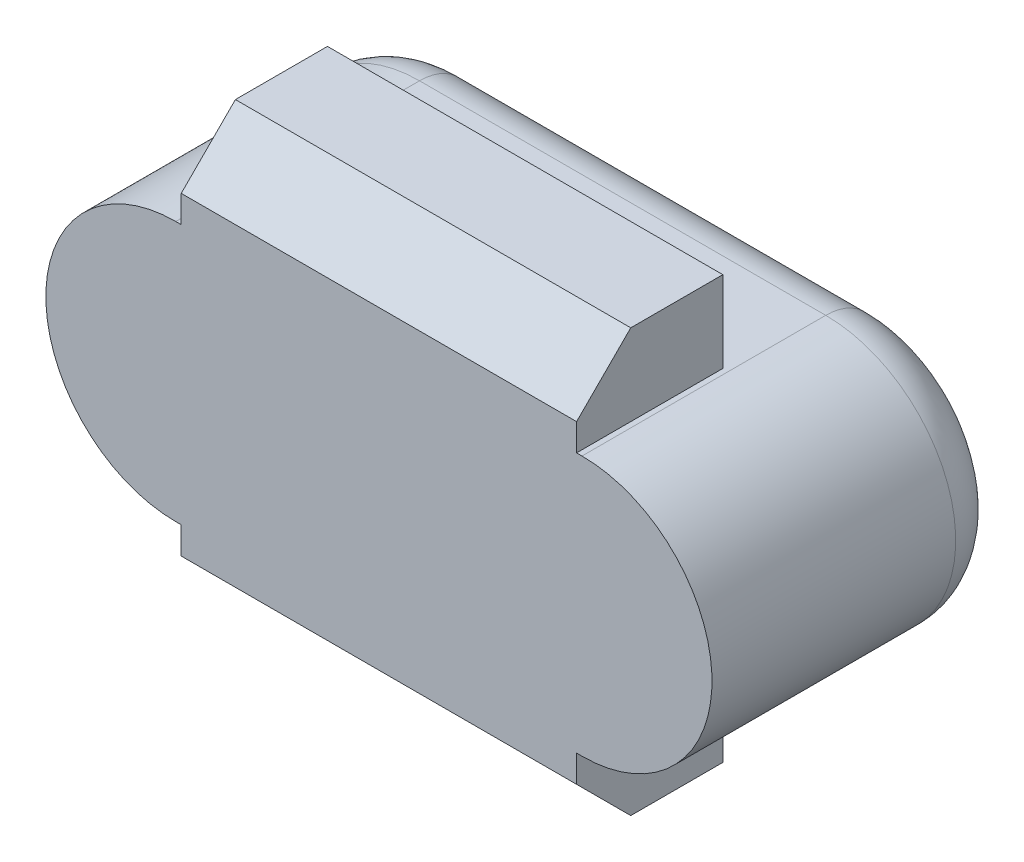
ISO-10303-21;
HEADER;
FILE_DESCRIPTION(('STEP AP214'),'2;1');
FILE_NAME('part.step','',(''),(''),'','','');
FILE_SCHEMA(('AUTOMOTIVE_DESIGN { 1 0 10303 214 1 1 1 1 }'));
ENDSEC;
DATA;
#1=APPLICATION_CONTEXT('core data for automotive mechanical design processes');
#2=APPLICATION_PROTOCOL_DEFINITION('international standard','automotive_design',2000,#1);
#3=PRODUCT_CONTEXT('',#1,'mechanical');
#4=PRODUCT('Part','Part','',(#3));
#5=PRODUCT_RELATED_PRODUCT_CATEGORY('part','',(#4));
#6=PRODUCT_DEFINITION_FORMATION('','',#4);
#7=PRODUCT_DEFINITION_CONTEXT('part definition',#1,'design');
#8=PRODUCT_DEFINITION('design','',#6,#7);
#9=PRODUCT_DEFINITION_SHAPE('','',#8);
#10=(LENGTH_UNIT() NAMED_UNIT(*) SI_UNIT(.MILLI.,.METRE.));
#11=(NAMED_UNIT(*) PLANE_ANGLE_UNIT() SI_UNIT($,.RADIAN.));
#12=(NAMED_UNIT(*) SI_UNIT($,.STERADIAN.) SOLID_ANGLE_UNIT());
#13=UNCERTAINTY_MEASURE_WITH_UNIT(LENGTH_MEASURE(1.E-05),#10,'distance_accuracy_value','');
#14=(GEOMETRIC_REPRESENTATION_CONTEXT(3) GLOBAL_UNCERTAINTY_ASSIGNED_CONTEXT((#13)) GLOBAL_UNIT_ASSIGNED_CONTEXT((#10,
#11,#12)) REPRESENTATION_CONTEXT('',''));
#15=CARTESIAN_POINT('',(0.,0.,0.));
#16=DIRECTION('',(0.,0.,1.));
#17=DIRECTION('',(1.,0.,0.));
#18=AXIS2_PLACEMENT_3D('',#15,#16,#17);
#19=CARTESIAN_POINT('',(0.,0.,5.5));
#20=DIRECTION('',(0.,0.,-1.));
#21=DIRECTION('',(-1.,0.,0.));
#22=AXIS2_PLACEMENT_3D('',#19,#20,#21);
#23=CYLINDRICAL_SURFACE('',#22,2.4);
#24=DIRECTION('',(0.,0.,-1.));
#25=VECTOR('',#24,1.);
#26=CARTESIAN_POINT('',(0.,2.4,5.5));
#27=LINE('',#26,#25);
#28=CARTESIAN_POINT('',(0.,2.4,5.5));
#29=VERTEX_POINT('',#28);
#30=CARTESIAN_POINT('',(0.,2.4,1.));
#31=VERTEX_POINT('',#30);
#32=EDGE_CURVE('E214',#29,#31,#27,.T.);
#33=ORIENTED_EDGE('',*,*,#32,.T.);
#34=CARTESIAN_POINT('',(0.,0.,1.));
#35=DIRECTION('',(0.,0.,1.));
#36=DIRECTION('',(1.,0.,0.));
#37=AXIS2_PLACEMENT_3D('',#34,#35,#36);
#38=CIRCLE('',#37,2.4);
#39=CARTESIAN_POINT('',(0.,-2.4,1.));
#40=VERTEX_POINT('',#39);
#41=EDGE_CURVE('E241',#31,#40,#38,.T.);
#42=ORIENTED_EDGE('',*,*,#41,.T.);
#43=DIRECTION('',(0.,0.,-1.));
#44=VECTOR('',#43,1.);
#45=CARTESIAN_POINT('',(0.,-2.4,5.5));
#46=LINE('',#45,#44);
#47=CARTESIAN_POINT('',(0.,-2.4,5.5));
#48=VERTEX_POINT('',#47);
#49=EDGE_CURVE('E223',#48,#40,#46,.T.);
#50=ORIENTED_EDGE('',*,*,#49,.F.);
#51=CARTESIAN_POINT('',(0.,0.,5.5));
#52=DIRECTION('',(0.,0.,1.));
#53=DIRECTION('',(1.,0.,0.));
#54=AXIS2_PLACEMENT_3D('',#51,#52,#53);
#55=CIRCLE('',#54,2.4);
#56=EDGE_CURVE('E201',#29,#48,#55,.T.);
#57=ORIENTED_EDGE('',*,*,#56,.F.);
#58=EDGE_LOOP('',(#33,#42,#50,#57));
#59=FACE_BOUND('',#58,.T.);
#60=ADVANCED_FACE('F35',(#59),#23,.T.);
#61=CARTESIAN_POINT('',(0.,-2.4,5.5));
#62=DIRECTION('',(0.,1.,0.));
#63=DIRECTION('',(-1.,0.,0.));
#64=AXIS2_PLACEMENT_3D('',#61,#62,#63);
#65=PLANE('',#64);
#66=ORIENTED_EDGE('',*,*,#49,.T.);
#67=DIRECTION('',(1.,0.,0.));
#68=VECTOR('',#67,1.);
#69=CARTESIAN_POINT('',(0.,-2.4,1.));
#70=LINE('',#69,#68);
#71=CARTESIAN_POINT('',(7.5,-2.4,1.));
#72=VERTEX_POINT('',#71);
#73=EDGE_CURVE('E239',#40,#72,#70,.T.);
#74=ORIENTED_EDGE('',*,*,#73,.T.);
#75=DIRECTION('',(0.,0.,-1.));
#76=VECTOR('',#75,1.);
#77=CARTESIAN_POINT('',(7.5,-2.4,5.5));
#78=LINE('',#77,#76);
#79=CARTESIAN_POINT('',(7.5,-2.4,5.5));
#80=VERTEX_POINT('',#79);
#81=EDGE_CURVE('E220',#80,#72,#78,.T.);
#82=ORIENTED_EDGE('',*,*,#81,.F.);
#83=DIRECTION('',(1.,0.,0.));
#84=VECTOR('',#83,1.);
#85=CARTESIAN_POINT('',(0.,-2.4,5.5));
#86=LINE('',#85,#84);
#87=CARTESIAN_POINT('',(7.4,-2.4,5.5));
#88=VERTEX_POINT('',#87);
#89=EDGE_CURVE('E204',#88,#80,#86,.T.);
#90=ORIENTED_EDGE('',*,*,#89,.F.);
#91=DIRECTION('',(0.,0.,-1.));
#92=VECTOR('',#91,1.);
#93=CARTESIAN_POINT('',(7.4,-2.4,5.5));
#94=LINE('',#93,#92);
#95=CARTESIAN_POINT('',(7.4,-2.4,2.8));
#96=VERTEX_POINT('',#95);
#97=EDGE_CURVE('E195',#88,#96,#94,.T.);
#98=ORIENTED_EDGE('',*,*,#97,.T.);
#99=DIRECTION('',(-1.,0.,0.));
#100=VECTOR('',#99,1.);
#101=CARTESIAN_POINT('',(0.,-2.4,2.8));
#102=LINE('',#101,#100);
#103=CARTESIAN_POINT('',(0.100000000000001,-2.4,2.8));
#104=VERTEX_POINT('',#103);
#105=EDGE_CURVE('E198',#96,#104,#102,.T.);
#106=ORIENTED_EDGE('',*,*,#105,.T.);
#107=DIRECTION('',(0.,0.,1.));
#108=VECTOR('',#107,1.);
#109=CARTESIAN_POINT('',(0.100000000000001,-2.4,5.5));
#110=LINE('',#109,#108);
#111=CARTESIAN_POINT('',(0.100000000000001,-2.4,5.5));
#112=VERTEX_POINT('',#111);
#113=EDGE_CURVE('E189',#104,#112,#110,.T.);
#114=ORIENTED_EDGE('',*,*,#113,.T.);
#115=EDGE_CURVE('E205',#48,#112,#86,.T.);
#116=ORIENTED_EDGE('',*,*,#115,.F.);
#117=EDGE_LOOP('',(#66,#74,#82,#90,#98,#106,#114,#116));
#118=FACE_BOUND('',#117,.T.);
#119=ADVANCED_FACE('F291',(#118),#65,.F.);
#120=CARTESIAN_POINT('',(7.5,0.,5.5));
#121=DIRECTION('',(0.,0.,-1.));
#122=DIRECTION('',(-1.,0.,0.));
#123=AXIS2_PLACEMENT_3D('',#120,#121,#122);
#124=CYLINDRICAL_SURFACE('',#123,2.4);
#125=ORIENTED_EDGE('',*,*,#81,.T.);
#126=CARTESIAN_POINT('',(7.5,0.,1.));
#127=DIRECTION('',(0.,0.,1.));
#128=DIRECTION('',(1.,0.,0.));
#129=AXIS2_PLACEMENT_3D('',#126,#127,#128);
#130=CIRCLE('',#129,2.4);
#131=CARTESIAN_POINT('',(7.5,2.4,1.));
#132=VERTEX_POINT('',#131);
#133=EDGE_CURVE('E227',#72,#132,#130,.T.);
#134=ORIENTED_EDGE('',*,*,#133,.T.);
#135=DIRECTION('',(0.,0.,-1.));
#136=VECTOR('',#135,1.);
#137=CARTESIAN_POINT('',(7.5,2.4,5.5));
#138=LINE('',#137,#136);
#139=CARTESIAN_POINT('',(7.5,2.4,5.5));
#140=VERTEX_POINT('',#139);
#141=EDGE_CURVE('E217',#140,#132,#138,.T.);
#142=ORIENTED_EDGE('',*,*,#141,.F.);
#143=CARTESIAN_POINT('',(7.5,0.,5.5));
#144=DIRECTION('',(0.,0.,1.));
#145=DIRECTION('',(1.,0.,0.));
#146=AXIS2_PLACEMENT_3D('',#143,#144,#145);
#147=CIRCLE('',#146,2.4);
#148=EDGE_CURVE('E208',#80,#140,#147,.T.);
#149=ORIENTED_EDGE('',*,*,#148,.F.);
#150=EDGE_LOOP('',(#125,#134,#142,#149));
#151=FACE_BOUND('',#150,.T.);
#152=ADVANCED_FACE('F298',(#151),#124,.T.);
#153=CARTESIAN_POINT('',(0.,2.4,5.5));
#154=DIRECTION('',(0.,-1.,0.));
#155=DIRECTION('',(1.,0.,0.));
#156=AXIS2_PLACEMENT_3D('',#153,#154,#155);
#157=PLANE('',#156);
#158=ORIENTED_EDGE('',*,*,#141,.T.);
#159=DIRECTION('',(-1.,0.,0.));
#160=VECTOR('',#159,1.);
#161=CARTESIAN_POINT('',(0.,2.4,1.));
#162=LINE('',#161,#160);
#163=EDGE_CURVE('E243',#132,#31,#162,.T.);
#164=ORIENTED_EDGE('',*,*,#163,.T.);
#165=ORIENTED_EDGE('',*,*,#32,.F.);
#166=DIRECTION('',(-1.,0.,0.));
#167=VECTOR('',#166,1.);
#168=CARTESIAN_POINT('',(0.,2.4,5.5));
#169=LINE('',#168,#167);
#170=CARTESIAN_POINT('',(0.1,2.4,5.5));
#171=VERTEX_POINT('',#170);
#172=EDGE_CURVE('E210',#171,#29,#169,.T.);
#173=ORIENTED_EDGE('',*,*,#172,.F.);
#174=DIRECTION('',(0.,0.,-1.));
#175=VECTOR('',#174,1.);
#176=CARTESIAN_POINT('',(0.0999999999999997,2.4,5.5));
#177=LINE('',#176,#175);
#178=CARTESIAN_POINT('',(0.0999999999999997,2.4,2.8));
#179=VERTEX_POINT('',#178);
#180=EDGE_CURVE('E182',#171,#179,#177,.T.);
#181=ORIENTED_EDGE('',*,*,#180,.T.);
#182=DIRECTION('',(1.,0.,0.));
#183=VECTOR('',#182,1.);
#184=CARTESIAN_POINT('',(0.,2.4,2.8));
#185=LINE('',#184,#183);
#186=CARTESIAN_POINT('',(7.4,2.4,2.8));
#187=VERTEX_POINT('',#186);
#188=EDGE_CURVE('E162',#179,#187,#185,.T.);
#189=ORIENTED_EDGE('',*,*,#188,.T.);
#190=DIRECTION('',(0.,0.,1.));
#191=VECTOR('',#190,1.);
#192=CARTESIAN_POINT('',(7.4,2.4,5.5));
#193=LINE('',#192,#191);
#194=CARTESIAN_POINT('',(7.4,2.4,5.5));
#195=VERTEX_POINT('',#194);
#196=EDGE_CURVE('E192',#187,#195,#193,.T.);
#197=ORIENTED_EDGE('',*,*,#196,.T.);
#198=EDGE_CURVE('E211',#140,#195,#169,.T.);
#199=ORIENTED_EDGE('',*,*,#198,.F.);
#200=EDGE_LOOP('',(#158,#164,#165,#173,#181,#189,#197,#199));
#201=FACE_BOUND('',#200,.T.);
#202=ADVANCED_FACE('F301',(#201),#157,.F.);
#203=CARTESIAN_POINT('',(0.,0.,5.5));
#204=DIRECTION('',(0.,0.,1.));
#205=DIRECTION('',(1.,0.,0.));
#206=AXIS2_PLACEMENT_3D('',#203,#204,#205);
#207=PLANE('',#206);
#208=DIRECTION('',(0.,-1.,0.));
#209=VECTOR('',#208,1.);
#210=CARTESIAN_POINT('',(0.0999999999999994,3.9,5.5));
#211=LINE('',#210,#209);
#212=CARTESIAN_POINT('',(0.100000000000001,-2.9,5.5));
#213=VERTEX_POINT('',#212);
#214=EDGE_CURVE('E179',#112,#213,#211,.T.);
#215=ORIENTED_EDGE('',*,*,#214,.T.);
#216=DIRECTION('',(1.,0.,0.));
#217=VECTOR('',#216,1.);
#218=CARTESIAN_POINT('',(0.,-2.9,5.5));
#219=LINE('',#218,#217);
#220=CARTESIAN_POINT('',(7.4,-2.9,5.5));
#221=VERTEX_POINT('',#220);
#222=EDGE_CURVE('E258',#213,#221,#219,.T.);
#223=ORIENTED_EDGE('',*,*,#222,.T.);
#224=DIRECTION('',(0.,1.,0.));
#225=VECTOR('',#224,1.);
#226=CARTESIAN_POINT('',(7.4,3.9,5.5));
#227=LINE('',#226,#225);
#228=EDGE_CURVE('E168',#221,#88,#227,.T.);
#229=ORIENTED_EDGE('',*,*,#228,.T.);
#230=ORIENTED_EDGE('',*,*,#89,.T.);
#231=ORIENTED_EDGE('',*,*,#148,.T.);
#232=ORIENTED_EDGE('',*,*,#198,.T.);
#233=CARTESIAN_POINT('',(7.4,2.9,5.5));
#234=VERTEX_POINT('',#233);
#235=EDGE_CURVE('E170',#195,#234,#227,.T.);
#236=ORIENTED_EDGE('',*,*,#235,.T.);
#237=DIRECTION('',(-1.,0.,0.));
#238=VECTOR('',#237,1.);
#239=CARTESIAN_POINT('',(0.,2.9,5.5));
#240=LINE('',#239,#238);
#241=CARTESIAN_POINT('',(0.0999999999999996,2.9,5.5));
#242=VERTEX_POINT('',#241);
#243=EDGE_CURVE('E245',#234,#242,#240,.T.);
#244=ORIENTED_EDGE('',*,*,#243,.T.);
#245=EDGE_CURVE('E178',#242,#171,#211,.T.);
#246=ORIENTED_EDGE('',*,*,#245,.T.);
#247=ORIENTED_EDGE('',*,*,#172,.T.);
#248=ORIENTED_EDGE('',*,*,#56,.T.);
#249=ORIENTED_EDGE('',*,*,#115,.T.);
#250=EDGE_LOOP('',(#215,#223,#229,#230,#231,#232,#236,#244,#246,#247,#248,#249));
#251=FACE_BOUND('',#250,.T.);
#252=ADVANCED_FACE('F276',(#251),#207,.T.);
#253=CARTESIAN_POINT('',(0.,0.,0.));
#254=DIRECTION('',(0.,0.,1.));
#255=DIRECTION('',(1.,0.,0.));
#256=AXIS2_PLACEMENT_3D('',#253,#254,#255);
#257=PLANE('',#256);
#258=DIRECTION('',(-1.,0.,0.));
#259=VECTOR('',#258,1.);
#260=CARTESIAN_POINT('',(0.,1.4,0.));
#261=LINE('',#260,#259);
#262=CARTESIAN_POINT('',(0.,1.4,0.));
#263=VERTEX_POINT('',#262);
#264=CARTESIAN_POINT('',(7.5,1.4,0.));
#265=VERTEX_POINT('',#264);
#266=EDGE_CURVE('E230',#263,#265,#261,.F.);
#267=ORIENTED_EDGE('',*,*,#266,.T.);
#268=CARTESIAN_POINT('',(7.5,0.,0.));
#269=DIRECTION('',(0.,0.,1.));
#270=DIRECTION('',(1.,0.,0.));
#271=AXIS2_PLACEMENT_3D('',#268,#269,#270);
#272=CIRCLE('',#271,1.4);
#273=CARTESIAN_POINT('',(7.5,-1.4,0.));
#274=VERTEX_POINT('',#273);
#275=EDGE_CURVE('E236',#265,#274,#272,.F.);
#276=ORIENTED_EDGE('',*,*,#275,.T.);
#277=DIRECTION('',(1.,0.,0.));
#278=VECTOR('',#277,1.);
#279=CARTESIAN_POINT('',(0.,-1.4,0.));
#280=LINE('',#279,#278);
#281=CARTESIAN_POINT('',(0.,-1.4,0.));
#282=VERTEX_POINT('',#281);
#283=EDGE_CURVE('E234',#274,#282,#280,.F.);
#284=ORIENTED_EDGE('',*,*,#283,.T.);
#285=CARTESIAN_POINT('',(0.,0.,0.));
#286=DIRECTION('',(0.,0.,1.));
#287=DIRECTION('',(1.,0.,0.));
#288=AXIS2_PLACEMENT_3D('',#285,#286,#287);
#289=CIRCLE('',#288,1.4);
#290=EDGE_CURVE('E232',#282,#263,#289,.F.);
#291=ORIENTED_EDGE('',*,*,#290,.T.);
#292=EDGE_LOOP('',(#267,#276,#284,#291));
#293=FACE_BOUND('',#292,.T.);
#294=ADVANCED_FACE('F353',(#293),#257,.F.);
#295=CARTESIAN_POINT('',(0.0999999999999994,3.9,2.8));
#296=DIRECTION('',(0.,1.,0.));
#297=DIRECTION('',(0.,0.,1.));
#298=AXIS2_PLACEMENT_3D('',#295,#296,#297);
#299=PLANE('',#298);
#300=DIRECTION('',(0.,0.,1.));
#301=VECTOR('',#300,1.);
#302=CARTESIAN_POINT('',(0.0999999999999994,3.9,2.8));
#303=LINE('',#302,#301);
#304=CARTESIAN_POINT('',(0.0999999999999994,3.9,2.8));
#305=VERTEX_POINT('',#304);
#306=CARTESIAN_POINT('',(0.0999999999999994,3.9,4.49999999999999));
#307=VERTEX_POINT('',#306);
#308=EDGE_CURVE('E146',#305,#307,#303,.T.);
#309=ORIENTED_EDGE('',*,*,#308,.T.);
#310=DIRECTION('',(1.,0.,0.));
#311=VECTOR('',#310,1.);
#312=CARTESIAN_POINT('',(0.0999999999999994,3.9,4.49999999999999));
#313=LINE('',#312,#311);
#314=CARTESIAN_POINT('',(7.4,3.9,4.49999999999999));
#315=VERTEX_POINT('',#314);
#316=EDGE_CURVE('E44',#307,#315,#313,.T.);
#317=ORIENTED_EDGE('',*,*,#316,.T.);
#318=DIRECTION('',(0.,0.,1.));
#319=VECTOR('',#318,1.);
#320=CARTESIAN_POINT('',(7.4,3.9,2.8));
#321=LINE('',#320,#319);
#322=CARTESIAN_POINT('',(7.4,3.9,2.8));
#323=VERTEX_POINT('',#322);
#324=EDGE_CURVE('E167',#323,#315,#321,.T.);
#325=ORIENTED_EDGE('',*,*,#324,.F.);
#326=DIRECTION('',(-1.,0.,0.));
#327=VECTOR('',#326,1.);
#328=CARTESIAN_POINT('',(0.0999999999999994,3.9,2.8));
#329=LINE('',#328,#327);
#330=EDGE_CURVE('E160',#323,#305,#329,.T.);
#331=ORIENTED_EDGE('',*,*,#330,.T.);
#332=EDGE_LOOP('',(#309,#317,#325,#331));
#333=FACE_BOUND('',#332,.T.);
#334=ADVANCED_FACE('F166',(#333),#299,.T.);
#335=CARTESIAN_POINT('',(0.,0.,2.8));
#336=DIRECTION('',(0.,0.,-1.));
#337=DIRECTION('',(-1.,0.,0.));
#338=AXIS2_PLACEMENT_3D('',#335,#336,#337);
#339=PLANE('',#338);
#340=ORIENTED_EDGE('',*,*,#188,.F.);
#341=DIRECTION('',(0.,-1.,0.));
#342=VECTOR('',#341,1.);
#343=CARTESIAN_POINT('',(0.0999999999999994,3.9,2.8));
#344=LINE('',#343,#342);
#345=EDGE_CURVE('E150',#305,#179,#344,.T.);
#346=ORIENTED_EDGE('',*,*,#345,.F.);
#347=ORIENTED_EDGE('',*,*,#330,.F.);
#348=DIRECTION('',(0.,1.,0.));
#349=VECTOR('',#348,1.);
#350=CARTESIAN_POINT('',(7.4,3.9,2.8));
#351=LINE('',#350,#349);
#352=EDGE_CURVE('E175',#187,#323,#351,.T.);
#353=ORIENTED_EDGE('',*,*,#352,.F.);
#354=EDGE_LOOP('',(#340,#346,#347,#353));
#355=FACE_BOUND('',#354,.T.);
#356=ADVANCED_FACE('F158',(#355),#339,.T.);
#357=CARTESIAN_POINT('',(0.0999999999999994,3.9,2.8));
#358=DIRECTION('',(-1.,0.,0.));
#359=DIRECTION('',(0.,-1.,0.));
#360=AXIS2_PLACEMENT_3D('',#357,#358,#359);
#361=PLANE('',#360);
#362=ORIENTED_EDGE('',*,*,#245,.F.);
#363=DIRECTION('',(0.,-0.707106781186546,0.707106781186549));
#364=VECTOR('',#363,1.);
#365=CARTESIAN_POINT('',(0.0999999999999992,4.75,3.64999999999999));
#366=LINE('',#365,#364);
#367=EDGE_CURVE('E58',#242,#307,#366,.F.);
#368=ORIENTED_EDGE('',*,*,#367,.T.);
#369=ORIENTED_EDGE('',*,*,#308,.F.);
#370=ORIENTED_EDGE('',*,*,#345,.T.);
#371=ORIENTED_EDGE('',*,*,#180,.F.);
#372=EDGE_LOOP('',(#362,#368,#369,#370,#371));
#373=FACE_BOUND('',#372,.T.);
#374=ADVANCED_FACE('F148',(#373),#361,.T.);
#375=CARTESIAN_POINT('',(7.4,3.9,2.8));
#376=DIRECTION('',(1.,0.,0.));
#377=DIRECTION('',(0.,1.,0.));
#378=AXIS2_PLACEMENT_3D('',#375,#376,#377);
#379=PLANE('',#378);
#380=ORIENTED_EDGE('',*,*,#324,.T.);
#381=DIRECTION('',(0.,0.707106781186546,-0.707106781186549));
#382=VECTOR('',#381,1.);
#383=CARTESIAN_POINT('',(7.4,4.75,3.64999999999999));
#384=LINE('',#383,#382);
#385=EDGE_CURVE('E11',#315,#234,#384,.F.);
#386=ORIENTED_EDGE('',*,*,#385,.T.);
#387=ORIENTED_EDGE('',*,*,#235,.F.);
#388=ORIENTED_EDGE('',*,*,#196,.F.);
#389=ORIENTED_EDGE('',*,*,#352,.T.);
#390=EDGE_LOOP('',(#380,#386,#387,#388,#389));
#391=FACE_BOUND('',#390,.T.);
#392=ADVANCED_FACE('F303',(#391),#379,.T.);
#393=ORIENTED_EDGE('',*,*,#105,.F.);
#394=CARTESIAN_POINT('',(7.4,-3.9,2.8));
#395=VERTEX_POINT('',#394);
#396=EDGE_CURVE('E154',#395,#96,#351,.T.);
#397=ORIENTED_EDGE('',*,*,#396,.F.);
#398=DIRECTION('',(1.,0.,0.));
#399=VECTOR('',#398,1.);
#400=CARTESIAN_POINT('',(0.100000000000001,-3.9,2.8));
#401=LINE('',#400,#399);
#402=CARTESIAN_POINT('',(0.100000000000001,-3.9,2.8));
#403=VERTEX_POINT('',#402);
#404=EDGE_CURVE('E163',#403,#395,#401,.T.);
#405=ORIENTED_EDGE('',*,*,#404,.F.);
#406=EDGE_CURVE('E164',#104,#403,#344,.T.);
#407=ORIENTED_EDGE('',*,*,#406,.F.);
#408=EDGE_LOOP('',(#393,#397,#405,#407));
#409=FACE_BOUND('',#408,.T.);
#410=ADVANCED_FACE('F288',(#409),#339,.T.);
#411=ORIENTED_EDGE('',*,*,#228,.F.);
#412=DIRECTION('',(0.,0.707106781186546,0.707106781186549));
#413=VECTOR('',#412,1.);
#414=CARTESIAN_POINT('',(7.4,-0.850000000000014,7.54999999999999));
#415=LINE('',#414,#413);
#416=CARTESIAN_POINT('',(7.4,-3.9,4.49999999999999));
#417=VERTEX_POINT('',#416);
#418=EDGE_CURVE('E261',#221,#417,#415,.F.);
#419=ORIENTED_EDGE('',*,*,#418,.T.);
#420=DIRECTION('',(0.,0.,1.));
#421=VECTOR('',#420,1.);
#422=CARTESIAN_POINT('',(7.4,-3.9,2.8));
#423=LINE('',#422,#421);
#424=EDGE_CURVE('E183',#395,#417,#423,.T.);
#425=ORIENTED_EDGE('',*,*,#424,.F.);
#426=ORIENTED_EDGE('',*,*,#396,.T.);
#427=ORIENTED_EDGE('',*,*,#97,.F.);
#428=EDGE_LOOP('',(#411,#419,#425,#426,#427));
#429=FACE_BOUND('',#428,.T.);
#430=ADVANCED_FACE('F280',(#429),#379,.T.);
#431=DIRECTION('',(0.,0.,1.));
#432=VECTOR('',#431,1.);
#433=CARTESIAN_POINT('',(0.100000000000001,-3.9,2.8));
#434=LINE('',#433,#432);
#435=CARTESIAN_POINT('',(0.100000000000001,-3.9,4.49999999999999));
#436=VERTEX_POINT('',#435);
#437=EDGE_CURVE('E153',#403,#436,#434,.T.);
#438=ORIENTED_EDGE('',*,*,#437,.T.);
#439=DIRECTION('',(0.,-0.707106781186546,-0.707106781186549));
#440=VECTOR('',#439,1.);
#441=CARTESIAN_POINT('',(0.1,-0.850000000000014,7.54999999999999));
#442=LINE('',#441,#440);
#443=EDGE_CURVE('E265',#436,#213,#442,.F.);
#444=ORIENTED_EDGE('',*,*,#443,.T.);
#445=ORIENTED_EDGE('',*,*,#214,.F.);
#446=ORIENTED_EDGE('',*,*,#113,.F.);
#447=ORIENTED_EDGE('',*,*,#406,.T.);
#448=EDGE_LOOP('',(#438,#444,#445,#446,#447));
#449=FACE_BOUND('',#448,.T.);
#450=ADVANCED_FACE('F270',(#449),#361,.T.);
#451=CARTESIAN_POINT('',(0.100000000000001,-3.9,2.8));
#452=DIRECTION('',(0.,-1.,0.));
#453=DIRECTION('',(0.,0.,-1.));
#454=AXIS2_PLACEMENT_3D('',#451,#452,#453);
#455=PLANE('',#454);
#456=ORIENTED_EDGE('',*,*,#424,.T.);
#457=DIRECTION('',(-1.,0.,0.));
#458=VECTOR('',#457,1.);
#459=CARTESIAN_POINT('',(0.100000000000001,-3.9,4.49999999999999));
#460=LINE('',#459,#458);
#461=EDGE_CURVE('E263',#417,#436,#460,.T.);
#462=ORIENTED_EDGE('',*,*,#461,.T.);
#463=ORIENTED_EDGE('',*,*,#437,.F.);
#464=ORIENTED_EDGE('',*,*,#404,.T.);
#465=EDGE_LOOP('',(#456,#462,#463,#464));
#466=FACE_BOUND('',#465,.T.);
#467=ADVANCED_FACE('F283',(#466),#455,.T.);
#468=CARTESIAN_POINT('',(0.,0.,1.));
#469=DIRECTION('',(0.,0.,1.));
#470=DIRECTION('',(1.,0.,0.));
#471=AXIS2_PLACEMENT_3D('',#468,#469,#470);
#472=TOROIDAL_SURFACE('',#471,1.4,1.);
#473=CARTESIAN_POINT('',(0.,1.4,1.));
#474=DIRECTION('',(1.,0.,0.));
#475=DIRECTION('',(0.,0.,-1.));
#476=AXIS2_PLACEMENT_3D('',#473,#474,#475);
#477=CIRCLE('',#476,1.);
#478=EDGE_CURVE('E250',#263,#31,#477,.T.);
#479=ORIENTED_EDGE('',*,*,#478,.F.);
#480=ORIENTED_EDGE('',*,*,#290,.F.);
#481=CARTESIAN_POINT('',(0.,-1.4,1.));
#482=DIRECTION('',(1.,0.,0.));
#483=DIRECTION('',(0.,0.,-1.));
#484=AXIS2_PLACEMENT_3D('',#481,#482,#483);
#485=CIRCLE('',#484,1.);
#486=EDGE_CURVE('E253',#40,#282,#485,.T.);
#487=ORIENTED_EDGE('',*,*,#486,.F.);
#488=ORIENTED_EDGE('',*,*,#41,.F.);
#489=EDGE_LOOP('',(#479,#480,#487,#488));
#490=FACE_BOUND('',#489,.T.);
#491=ADVANCED_FACE('F331',(#490),#472,.T.);
#492=CARTESIAN_POINT('',(0.,-1.4,1.));
#493=DIRECTION('',(1.,0.,0.));
#494=DIRECTION('',(0.,1.,0.));
#495=AXIS2_PLACEMENT_3D('',#492,#493,#494);
#496=CYLINDRICAL_SURFACE('',#495,1.);
#497=ORIENTED_EDGE('',*,*,#486,.T.);
#498=ORIENTED_EDGE('',*,*,#283,.F.);
#499=CARTESIAN_POINT('',(7.5,-1.4,1.));
#500=DIRECTION('',(1.,0.,0.));
#501=DIRECTION('',(0.,0.,-1.));
#502=AXIS2_PLACEMENT_3D('',#499,#500,#501);
#503=CIRCLE('',#502,1.);
#504=EDGE_CURVE('E248',#72,#274,#503,.T.);
#505=ORIENTED_EDGE('',*,*,#504,.F.);
#506=ORIENTED_EDGE('',*,*,#73,.F.);
#507=EDGE_LOOP('',(#497,#498,#505,#506));
#508=FACE_BOUND('',#507,.T.);
#509=ADVANCED_FACE('F327',(#508),#496,.T.);
#510=CARTESIAN_POINT('',(0.,1.4,1.));
#511=DIRECTION('',(-1.,0.,0.));
#512=DIRECTION('',(0.,-1.,0.));
#513=AXIS2_PLACEMENT_3D('',#510,#511,#512);
#514=CYLINDRICAL_SURFACE('',#513,1.);
#515=ORIENTED_EDGE('',*,*,#478,.T.);
#516=ORIENTED_EDGE('',*,*,#163,.F.);
#517=CARTESIAN_POINT('',(7.5,1.4,1.));
#518=DIRECTION('',(1.,0.,0.));
#519=DIRECTION('',(0.,0.,-1.));
#520=AXIS2_PLACEMENT_3D('',#517,#518,#519);
#521=CIRCLE('',#520,1.);
#522=EDGE_CURVE('E246',#265,#132,#521,.T.);
#523=ORIENTED_EDGE('',*,*,#522,.F.);
#524=ORIENTED_EDGE('',*,*,#266,.F.);
#525=EDGE_LOOP('',(#515,#516,#523,#524));
#526=FACE_BOUND('',#525,.T.);
#527=ADVANCED_FACE('F323',(#526),#514,.T.);
#528=CARTESIAN_POINT('',(7.5,0.,1.));
#529=DIRECTION('',(0.,0.,1.));
#530=DIRECTION('',(1.,0.,0.));
#531=AXIS2_PLACEMENT_3D('',#528,#529,#530);
#532=TOROIDAL_SURFACE('',#531,1.4,1.);
#533=ORIENTED_EDGE('',*,*,#504,.T.);
#534=ORIENTED_EDGE('',*,*,#275,.F.);
#535=ORIENTED_EDGE('',*,*,#522,.T.);
#536=ORIENTED_EDGE('',*,*,#133,.F.);
#537=EDGE_LOOP('',(#533,#534,#535,#536));
#538=FACE_BOUND('',#537,.T.);
#539=ADVANCED_FACE('F311',(#538),#532,.T.);
#540=CARTESIAN_POINT('',(0.,-2.9,5.5));
#541=DIRECTION('',(0.,0.707106781186549,-0.707106781186546));
#542=DIRECTION('',(1.,0.,0.));
#543=AXIS2_PLACEMENT_3D('',#540,#541,#542);
#544=PLANE('',#543);
#545=ORIENTED_EDGE('',*,*,#443,.F.);
#546=ORIENTED_EDGE('',*,*,#461,.F.);
#547=ORIENTED_EDGE('',*,*,#418,.F.);
#548=ORIENTED_EDGE('',*,*,#222,.F.);
#549=EDGE_LOOP('',(#545,#546,#547,#548));
#550=FACE_BOUND('',#549,.T.);
#551=ADVANCED_FACE('F278',(#550),#544,.F.);
#552=CARTESIAN_POINT('',(0.,2.9,5.5));
#553=DIRECTION('',(0.,-0.707106781186549,-0.707106781186546));
#554=DIRECTION('',(-1.,0.,0.));
#555=AXIS2_PLACEMENT_3D('',#552,#553,#554);
#556=PLANE('',#555);
#557=ORIENTED_EDGE('',*,*,#385,.F.);
#558=ORIENTED_EDGE('',*,*,#316,.F.);
#559=ORIENTED_EDGE('',*,*,#367,.F.);
#560=ORIENTED_EDGE('',*,*,#243,.F.);
#561=EDGE_LOOP('',(#557,#558,#559,#560));
#562=FACE_BOUND('',#561,.T.);
#563=ADVANCED_FACE('F38',(#562),#556,.F.);
#564=CLOSED_SHELL('',(#60,#119,#152,#202,#252,#294,#334,#356,#374,#392,#410,#430,#450,#467,#491,
#509,#527,#539,#551,#563));
#565=MANIFOLD_SOLID_BREP('B2',#564);
#566=ADVANCED_BREP_SHAPE_REPRESENTATION('',(#18,#565),#14);
#567=SHAPE_DEFINITION_REPRESENTATION(#9,#566);
ENDSEC;
END-ISO-10303-21;
